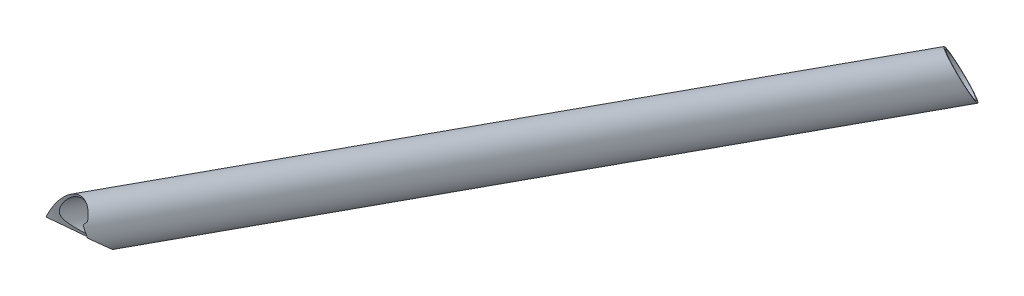
ISO-10303-21;
HEADER;
FILE_DESCRIPTION(('STEP AP214'),'2;1');
FILE_NAME('part.step','',(''),(''),'','','');
FILE_SCHEMA(('AUTOMOTIVE_DESIGN { 1 0 10303 214 1 1 1 1 }'));
ENDSEC;
DATA;
#1=APPLICATION_CONTEXT('core data for automotive mechanical design processes');
#2=APPLICATION_PROTOCOL_DEFINITION('international standard','automotive_design',2000,#1);
#3=PRODUCT_CONTEXT('',#1,'mechanical');
#4=PRODUCT('Part','Part','',(#3));
#5=PRODUCT_RELATED_PRODUCT_CATEGORY('part','',(#4));
#6=PRODUCT_DEFINITION_FORMATION('','',#4);
#7=PRODUCT_DEFINITION_CONTEXT('part definition',#1,'design');
#8=PRODUCT_DEFINITION('design','',#6,#7);
#9=PRODUCT_DEFINITION_SHAPE('','',#8);
#10=(LENGTH_UNIT() NAMED_UNIT(*) SI_UNIT(.MILLI.,.METRE.));
#11=(NAMED_UNIT(*) PLANE_ANGLE_UNIT() SI_UNIT($,.RADIAN.));
#12=(NAMED_UNIT(*) SI_UNIT($,.STERADIAN.) SOLID_ANGLE_UNIT());
#13=UNCERTAINTY_MEASURE_WITH_UNIT(LENGTH_MEASURE(1.E-05),#10,'distance_accuracy_value','');
#14=(GEOMETRIC_REPRESENTATION_CONTEXT(3) GLOBAL_UNCERTAINTY_ASSIGNED_CONTEXT((#13)) GLOBAL_UNIT_ASSIGNED_CONTEXT((#10,
#11,#12)) REPRESENTATION_CONTEXT('',''));
#15=CARTESIAN_POINT('',(0.,0.,0.));
#16=DIRECTION('',(0.,0.,1.));
#17=DIRECTION('',(1.,0.,0.));
#18=AXIS2_PLACEMENT_3D('',#15,#16,#17);
#19=CARTESIAN_POINT('',(-325.,320.000000000001,-1580.));
#20=DIRECTION('',(0.171152156864514,-0.228202875819352,-0.958452078441276));
#21=DIRECTION('',(0.,0.972806214685367,-0.23162052730604));
#22=AXIS2_PLACEMENT_3D('',#19,#20,#21);
#23=CYLINDRICAL_SURFACE('',#22,11.3);
#24=CARTESIAN_POINT('',(-247.021624977949,216.028833303932,-2016.67890012349));
#25=DIRECTION('',(0.452196947301957,0.442935804004753,-0.774161349061973));
#26=DIRECTION('',(-0.2208732865147,-0.785327240941154,-0.578339101168122));
#27=AXIS2_PLACEMENT_3D('',#24,#25,#26);
#28=ELLIPSE('',#27,15.7313297667967,11.3);
#29=CARTESIAN_POINT('',(-250.496255484788,203.674591501838,-2025.77694324099));
#30=VERTEX_POINT('',#29);
#31=EDGE_CURVE('E92',#30,#30,#28,.T.);
#32=ORIENTED_EDGE('',*,*,#31,.T.);
#33=EDGE_LOOP('',(#32));
#34=FACE_BOUND('',#33,.T.);
#35=CARTESIAN_POINT('',(-323.751258230113,329.327721199429,-1589.61026586993));
#36=CARTESIAN_POINT('',(-324.041741552459,329.311996243925,-1589.67631641611));
#37=CARTESIAN_POINT('',(-324.333259405906,329.285849810839,-1589.73525665512));
#38=CARTESIAN_POINT('',(-324.916306957658,329.212853012217,-1589.83832996622));
#39=CARTESIAN_POINT('',(-325.207836652548,329.166004506466,-1589.88246436776));
#40=CARTESIAN_POINT('',(-325.788722927312,329.051946080014,-1589.95555465044));
#41=CARTESIAN_POINT('',(-326.078080063961,328.984741572227,-1589.98451456108));
#42=CARTESIAN_POINT('',(-326.652602594052,328.830481437029,-1590.02715435897));
#43=CARTESIAN_POINT('',(-326.937767889434,328.743425346011,-1590.04083388931));
#44=CARTESIAN_POINT('',(-327.501609247605,328.550233276816,-1590.05303025706));
#45=CARTESIAN_POINT('',(-327.78029070413,328.444113848369,-1590.05156018461));
#46=CARTESIAN_POINT('',(-328.329481908372,328.213570460657,-1590.03385215686));
#47=CARTESIAN_POINT('',(-328.599991704135,328.089146609036,-1590.01761428841));
#48=CARTESIAN_POINT('',(-329.131022234793,327.822930037697,-1589.97096483869));
#49=CARTESIAN_POINT('',(-329.391543716696,327.68113862021,-1589.94055431961));
#50=CARTESIAN_POINT('',(-329.900977922361,327.381161531198,-1589.86637028519));
#51=CARTESIAN_POINT('',(-330.149890435476,327.222975562357,-1589.82259652749));
#52=CARTESIAN_POINT('',(-330.640221357807,326.887368497511,-1589.72155088308));
#53=CARTESIAN_POINT('',(-330.881333786556,326.709587451766,-1589.66399052086));
#54=CARTESIAN_POINT('',(-331.348421578,326.338926653219,-1589.53726973269));
#55=CARTESIAN_POINT('',(-331.574396542985,326.146046504002,-1589.46810900213));
#56=CARTESIAN_POINT('',(-332.010208439658,325.745845430282,-1589.31965798748));
#57=CARTESIAN_POINT('',(-332.220022856131,325.538505098897,-1589.24035396639));
#58=CARTESIAN_POINT('',(-332.621953313275,325.110412633486,-1589.07357261488));
#59=CARTESIAN_POINT('',(-332.814069569966,324.889660663215,-1588.98609538425));
#60=CARTESIAN_POINT('',(-333.192961540393,324.418499110931,-1588.79852894446));
#61=CARTESIAN_POINT('',(-333.378289135681,324.167103782964,-1588.69798548307));
#62=CARTESIAN_POINT('',(-333.725688145917,323.649834040866,-1588.49355639102));
#63=CARTESIAN_POINT('',(-333.887751009736,323.383954352178,-1588.38966954856));
#64=CARTESIAN_POINT('',(-334.186487478159,322.838349137935,-1588.1834118901));
#65=CARTESIAN_POINT('',(-334.323203726046,322.558647888946,-1588.08103879944));
#66=CARTESIAN_POINT('',(-334.569252622558,321.984940422908,-1587.88397965418));
#67=CARTESIAN_POINT('',(-334.678610082431,321.690947457941,-1587.78928668767));
#68=CARTESIAN_POINT('',(-334.823223665689,321.228972716068,-1587.65666150823));
#69=CARTESIAN_POINT('',(-334.86927957078,321.066025853175,-1587.61282359525));
#70=CARTESIAN_POINT('',(-334.952242868899,320.736266226439,-1587.53159362452));
#71=CARTESIAN_POINT('',(-334.98915368697,320.569454935584,-1587.49419915515));
#72=CARTESIAN_POINT('',(-335.053246354102,320.232726954294,-1587.42781260805));
#73=CARTESIAN_POINT('',(-335.080451451025,320.062818723045,-1587.39880048446));
#74=CARTESIAN_POINT('',(-335.124810645557,319.720229887382,-1587.35104172031));
#75=CARTESIAN_POINT('',(-335.141964853109,319.547549313315,-1587.33229496746));
#76=CARTESIAN_POINT('',(-335.166117345776,319.198311077857,-1587.30674813398));
#77=CARTESIAN_POINT('',(-335.172981761045,319.021732138022,-1587.30010528955));
#78=CARTESIAN_POINT('',(-335.176203162723,318.668500850097,-1587.30066893354));
#79=CARTESIAN_POINT('',(-335.17256139634,318.49184851321,-1587.30787377805));
#80=CARTESIAN_POINT('',(-335.155282731625,318.140247396349,-1587.33671800154));
#81=CARTESIAN_POINT('',(-335.141647216914,317.96529838395,-1587.35835538234));
#82=CARTESIAN_POINT('',(-335.105291773105,317.618684906002,-1587.41568629307));
#83=CARTESIAN_POINT('',(-335.082570263493,317.447021017348,-1587.45138226849));
#84=CARTESIAN_POINT('',(-335.024778247906,317.080180733582,-1587.54262674341));
#85=CARTESIAN_POINT('',(-334.988287676058,316.885805680774,-1587.60048087486));
#86=CARTESIAN_POINT('',(-334.906397515816,316.504096956015,-1587.73106977175));
#87=CARTESIAN_POINT('',(-334.860995054156,316.316765578274,-1587.80380933671));
#88=CARTESIAN_POINT('',(-334.762729262056,315.948552686318,-1587.96169275098));
#89=CARTESIAN_POINT('',(-334.709836441974,315.76770038679,-1588.04688567425));
#90=CARTESIAN_POINT('',(-334.598037480197,315.412878340422,-1588.22691945225));
#91=CARTESIAN_POINT('',(-334.539131935136,315.238907913075,-1588.32175934971));
#92=CARTESIAN_POINT('',(-334.391852680283,314.829269447575,-1588.5581881768));
#93=CARTESIAN_POINT('',(-334.30107083218,314.596556254696,-1588.70337782912));
#94=CARTESIAN_POINT('',(-334.111370431192,314.141350537203,-1589.00419779822));
#95=CARTESIAN_POINT('',(-334.012447434317,313.918863699481,-1589.15983380866));
#96=CARTESIAN_POINT('',(-333.80734052403,313.482178910973,-1589.47873219965));
#97=CARTESIAN_POINT('',(-333.701142983559,313.267997762504,-1589.64200870096));
#98=CARTESIAN_POINT('',(-333.482295353644,312.847123360164,-1589.97366114461));
#99=CARTESIAN_POINT('',(-333.369646536747,312.640428642599,-1590.1420360782));
#100=CARTESIAN_POINT('',(-333.137591221974,312.232394799222,-1590.48321610394));
#101=CARTESIAN_POINT('',(-333.018151681567,312.031090396413,-1590.65604013168));
#102=CARTESIAN_POINT('',(-332.773225529482,311.634245309623,-1591.0040105314));
#103=CARTESIAN_POINT('',(-332.647738685614,311.438704847416,-1591.17915699236));
#104=CARTESIAN_POINT('',(-332.390900855709,311.053076069143,-1591.53060112541));
#105=CARTESIAN_POINT('',(-332.259556601272,310.862981886779,-1591.70689728684));
#106=CARTESIAN_POINT('',(-331.990816595712,310.487651525924,-1592.06005082119));
#107=CARTESIAN_POINT('',(-331.853420758798,310.302415416365,-1592.23690820202));
#108=CARTESIAN_POINT('',(-331.559421515836,309.919607473818,-1592.60691312888));
#109=CARTESIAN_POINT('',(-331.402218628345,309.722485233273,-1592.80004999189));
#110=CARTESIAN_POINT('',(-331.080193526084,309.333636840674,-1593.18541282211));
#111=CARTESIAN_POINT('',(-330.915371190314,309.141910774391,-1593.3776387748));
#112=CARTESIAN_POINT('',(-330.577678858847,308.763751202199,-1593.76057037541));
#113=CARTESIAN_POINT('',(-330.404803712267,308.577321210059,-1593.95127495628));
#114=CARTESIAN_POINT('',(-330.050715383068,308.210047054585,-1594.33030275246));
#115=CARTESIAN_POINT('',(-329.869502457027,308.029202719648,-1594.51862604083));
#116=CARTESIAN_POINT('',(-329.499396621347,307.674483025716,-1594.89099215815));
#117=CARTESIAN_POINT('',(-329.310557355195,307.50057185984,-1595.07505410094));
#118=CARTESIAN_POINT('',(-328.923620580929,307.159000638051,-1595.43926270048));
#119=CARTESIAN_POINT('',(-328.725522488508,306.991340977863,-1595.61940910907));
#120=CARTESIAN_POINT('',(-328.319639643565,306.66305990845,-1595.97467124303));
#121=CARTESIAN_POINT('',(-328.111863566001,306.502432437221,-1596.14979125463));
#122=CARTESIAN_POINT('',(-327.685801598423,306.188928236851,-1596.49401999933));
#123=CARTESIAN_POINT('',(-327.46751793965,306.036049876251,-1596.66312999549));
#124=CARTESIAN_POINT('',(-327.071435094099,305.773472091093,-1596.95573746248));
#125=CARTESIAN_POINT('',(-326.895946880236,305.66196292281,-1597.08073943691));
#126=CARTESIAN_POINT('',(-326.537914038257,305.444816706861,-1597.325645961));
#127=CARTESIAN_POINT('',(-326.355369751816,305.339179375467,-1597.4455507569));
#128=CARTESIAN_POINT('',(-325.982560871548,305.134407501147,-1597.67954598272));
#129=CARTESIAN_POINT('',(-325.792285166204,305.03528289475,-1597.79362747141));
#130=CARTESIAN_POINT('',(-325.40391561831,304.844683407837,-1598.01469369533));
#131=CARTESIAN_POINT('',(-325.205821727573,304.753208574478,-1598.12167838681));
#132=CARTESIAN_POINT('',(-324.79964066816,304.578296811185,-1598.32818096932));
#133=CARTESIAN_POINT('',(-324.591479025948,304.494940508375,-1598.42762214312));
#134=CARTESIAN_POINT('',(-324.166793398036,304.338734617483,-1598.61627288983));
#135=CARTESIAN_POINT('',(-323.950268357329,304.265886360469,-1598.70548116625));
#136=CARTESIAN_POINT('',(-323.28885089704,304.065976796177,-1598.95456487398));
#137=CARTESIAN_POINT('',(-322.830897702026,303.957005253197,-1599.09654148468));
#138=CARTESIAN_POINT('',(-322.03459456998,303.828924705383,-1599.27902110132));
#139=CARTESIAN_POINT('',(-321.703234443465,303.792422694356,-1599.33734165765));
#140=CARTESIAN_POINT('',(-321.201466758177,303.76572843781,-1599.39550932695));
#141=CARTESIAN_POINT('',(-321.033425707579,303.761506653433,-1599.41001302498));
#142=CARTESIAN_POINT('',(-320.696838928207,303.762978109627,-1599.42857233779));
#143=CARTESIAN_POINT('',(-320.528293434349,303.768667289592,-1599.4326322298));
#144=CARTESIAN_POINT('',(-320.190745840791,303.790440442642,-1599.42977884228));
#145=CARTESIAN_POINT('',(-320.021749088605,303.806598425372,-1599.42278692086));
#146=CARTESIAN_POINT('',(-319.685961874365,303.849523849109,-1599.39743450421));
#147=CARTESIAN_POINT('',(-319.519171394974,303.876291206704,-1599.37907409836));
#148=CARTESIAN_POINT('',(-319.189251749861,303.940280479325,-1599.33105928373));
#149=CARTESIAN_POINT('',(-319.026122849384,303.977503149117,-1599.30140405952));
#150=CARTESIAN_POINT('',(-318.70488585166,304.061947784595,-1599.23120470535));
#151=CARTESIAN_POINT('',(-318.546777645438,304.109169533079,-1599.19066081191));
#152=CARTESIAN_POINT('',(-318.249811101207,304.208524745365,-1599.10323025427));
#153=CARTESIAN_POINT('',(-318.110455274599,304.259905660957,-1599.05716938872));
#154=CARTESIAN_POINT('',(-317.837483776558,304.369811655641,-1598.95716003113));
#155=CARTESIAN_POINT('',(-317.703869955359,304.428339014524,-1598.90320902095));
#156=CARTESIAN_POINT('',(-317.312395459032,304.613552590078,-1598.73064943269));
#157=CARTESIAN_POINT('',(-317.063780055144,304.749911913345,-1598.60129749982));
#158=CARTESIAN_POINT('',(-316.458767467789,305.125852587942,-1598.24019155288));
#159=CARTESIAN_POINT('',(-316.121340576415,305.380076868908,-1597.99200036161));
#160=CARTESIAN_POINT('',(-315.659882857279,305.784867507471,-1597.59314794569));
#161=CARTESIAN_POINT('',(-315.513295196593,305.923968864014,-1597.45550724403));
#162=CARTESIAN_POINT('',(-315.233905080624,306.208570705367,-1597.17301459981));
#163=CARTESIAN_POINT('',(-315.101100092467,306.354070007389,-1597.0281639895));
#164=CARTESIAN_POINT('',(-314.756090991496,306.758051159086,-1596.62513654624));
#165=CARTESIAN_POINT('',(-314.556516290181,307.021630828621,-1596.36126736557));
#166=CARTESIAN_POINT('',(-314.19004879743,307.559551219769,-1595.8219693053));
#167=CARTESIAN_POINT('',(-314.023181894077,307.833900260814,-1595.54653147685));
#168=CARTESIAN_POINT('',(-313.717393274215,308.391147794215,-1594.98719051994));
#169=CARTESIAN_POINT('',(-313.578554008258,308.674068774187,-1594.70326515707));
#170=CARTESIAN_POINT('',(-313.325847951824,309.245750611836,-1594.13052342057));
#171=CARTESIAN_POINT('',(-313.211974240051,309.534509826649,-1593.84170842648));
#172=CARTESIAN_POINT('',(-313.010072262168,310.106039816569,-1593.27187686241));
#173=CARTESIAN_POINT('',(-312.921243924989,310.388637132615,-1592.99096689131));
#174=CARTESIAN_POINT('',(-312.761969477822,310.95774478062,-1592.4278332185));
#175=CARTESIAN_POINT('',(-312.691526786737,311.244255829948,-1592.14560928237));
#176=CARTESIAN_POINT('',(-312.567347042405,311.82124380025,-1591.58085564856));
#177=CARTESIAN_POINT('',(-312.513630283743,312.11172509611,-1591.29832599361));
#178=CARTESIAN_POINT('',(-312.421748521439,312.696342870381,-1590.73458614264));
#179=CARTESIAN_POINT('',(-312.383582300795,312.9904790609,-1590.45337584505));
#180=CARTESIAN_POINT('',(-312.321869475436,313.582443841861,-1589.89392426306));
#181=CARTESIAN_POINT('',(-312.298306582916,313.880267939311,-1589.61568001227));
#182=CARTESIAN_POINT('',(-312.265068492927,314.480643205733,-1589.0634171704));
#183=CARTESIAN_POINT('',(-312.255394886551,314.783194912265,-1588.78939906701));
#184=CARTESIAN_POINT('',(-312.249595606928,315.393685533546,-1588.24807563441));
#185=CARTESIAN_POINT('',(-312.253452391568,315.701616958192,-1587.98076206559));
#186=CARTESIAN_POINT('',(-312.274697426952,316.324805445706,-1587.4554511517));
#187=CARTESIAN_POINT('',(-312.292081836171,316.64006040421,-1587.19745118355));
#188=CARTESIAN_POINT('',(-312.332422205134,317.168576710109,-1586.78284880886));
#189=CARTESIAN_POINT('',(-312.351316462699,317.379036841275,-1586.62228238584));
#190=CARTESIAN_POINT('',(-312.395425253175,317.804986776936,-1586.30875554599));
#191=CARTESIAN_POINT('',(-312.420640584158,318.020477213418,-1586.15579609251));
#192=CARTESIAN_POINT('',(-312.477877073031,318.457167895363,-1585.86013445846));
#193=CARTESIAN_POINT('',(-312.509889939476,318.678360898782,-1585.7174200625));
#194=CARTESIAN_POINT('',(-312.581513554416,319.127706418448,-1585.44544739057));
#195=CARTESIAN_POINT('',(-312.621121629955,319.355856462644,-1585.31618440529));
#196=CARTESIAN_POINT('',(-312.695271388087,319.747267068021,-1585.11337658427));
#197=CARTESIAN_POINT('',(-312.727517235509,319.908481457238,-1585.03505733349));
#198=CARTESIAN_POINT('',(-312.796555298248,320.234599277384,-1584.88884276633));
#199=CARTESIAN_POINT('',(-312.833345824363,320.399501319105,-1584.82094359785));
#200=CARTESIAN_POINT('',(-312.911886211096,320.73241851698,-1584.69776928909));
#201=CARTESIAN_POINT('',(-312.953624948781,320.900426000418,-1584.64246662197));
#202=CARTESIAN_POINT('',(-313.042611728338,321.239147575826,-1584.54643760767));
#203=CARTESIAN_POINT('',(-313.089858407117,321.409860989141,-1584.50570766418));
#204=CARTESIAN_POINT('',(-313.183018414107,321.727922856161,-1584.44531065863));
#205=CARTESIAN_POINT('',(-313.22813949774,321.875086397599,-1584.42345167615));
#206=CARTESIAN_POINT('',(-313.322880329165,322.169300769648,-1584.39239486906));
#207=CARTESIAN_POINT('',(-313.372499549853,322.316351611433,-1584.38319556299));
#208=CARTESIAN_POINT('',(-313.476308768981,322.609086401076,-1584.37757146445));
#209=CARTESIAN_POINT('',(-313.530499038896,322.754770267179,-1584.38114743123));
#210=CARTESIAN_POINT('',(-313.643427092114,323.043545283466,-1584.40056614603));
#211=CARTESIAN_POINT('',(-313.702165789413,323.186635905379,-1584.41641136532));
#212=CARTESIAN_POINT('',(-313.837981747323,323.501323108378,-1584.46425064427));
#213=CARTESIAN_POINT('',(-313.916190775192,323.671998257823,-1584.49909864775));
#214=CARTESIAN_POINT('',(-314.079129255056,324.006513298645,-1584.58325884162));
#215=CARTESIAN_POINT('',(-314.163860634862,324.170351146885,-1584.63257532066));
#216=CARTESIAN_POINT('',(-314.339912075743,324.490938102564,-1584.74313248361));
#217=CARTESIAN_POINT('',(-314.431251423731,324.647664092348,-1584.80440903862));
#218=CARTESIAN_POINT('',(-314.620166851179,324.953262829518,-1584.93627546229));
#219=CARTESIAN_POINT('',(-314.717745119427,325.102132786981,-1585.00686860883));
#220=CARTESIAN_POINT('',(-314.972883247554,325.469525237977,-1585.19480951489));
#221=CARTESIAN_POINT('',(-315.134607568915,325.68270889904,-1585.3169678333));
#222=CARTESIAN_POINT('',(-315.472246261984,326.09091773746,-1585.5716255199));
#223=CARTESIAN_POINT('',(-315.648167718776,326.285933742348,-1585.70413005028));
#224=CARTESIAN_POINT('',(-316.013970392474,326.658269235374,-1585.97479169515));
#225=CARTESIAN_POINT('',(-316.203856537836,326.835582423232,-1586.11295079755));
#226=CARTESIAN_POINT('',(-316.597170527829,327.172654401223,-1586.39124995041));
#227=CARTESIAN_POINT('',(-316.800596254432,327.332415926687,-1586.53138968833));
#228=CARTESIAN_POINT('',(-317.228901804239,327.640427344532,-1586.81636522295));
#229=CARTESIAN_POINT('',(-317.45431210564,327.787971296256,-1586.96116734168));
#230=CARTESIAN_POINT('',(-317.918678394088,328.063951108611,-1587.24724310637));
#231=CARTESIAN_POINT('',(-318.157634867199,328.192386282981,-1587.38851662544));
#232=CARTESIAN_POINT('',(-318.6482020094,328.429747204232,-1587.66527872673));
#233=CARTESIAN_POINT('',(-318.899810526864,328.538676254079,-1587.80076828538));
#234=CARTESIAN_POINT('',(-319.414649975499,328.736565568647,-1588.06402853228));
#235=CARTESIAN_POINT('',(-319.677880793885,328.825526027095,-1588.19179929542));
#236=CARTESIAN_POINT('',(-320.243882049828,328.991512793551,-1588.45125845014));
#237=CARTESIAN_POINT('',(-320.547841985481,329.066193908489,-1588.58186541237));
#238=CARTESIAN_POINT('',(-321.166465586699,329.189688814995,-1588.82935158777));
#239=CARTESIAN_POINT('',(-321.481130291899,329.238500086438,-1588.94622946266));
#240=CARTESIAN_POINT('',(-322.118688356076,329.309676368437,-1589.16438670105));
#241=CARTESIAN_POINT('',(-322.441579903981,329.332047149139,-1589.26566946369));
#242=CARTESIAN_POINT('',(-323.092956344179,329.349994836862,-1589.45111061813));
#243=CARTESIAN_POINT('',(-323.421440450781,329.345575477128,-1589.5352713942));
#244=CARTESIAN_POINT('',(-323.751258230113,329.327721199429,-1589.61026586993));
#245=B_SPLINE_CURVE_WITH_KNOTS('',3,(#35,#36,#37,#38,#39,#40,#41,#42,#43,#44,#45,#46,#47,#48,
#49,#50,#51,#52,#53,#54,#55,#56,#57,#58,#59,#60,#61,#62,#63,#64,#65,#66,#67,#68,#69,#70,#71,#72,
#73,#74,#75,#76,#77,#78,#79,#80,#81,#82,#83,#84,#85,#86,#87,#88,#89,#90,#91,#92,#93,#94,#95,#96,
#97,#98,#99,#100,#101,#102,#103,#104,#105,#106,#107,#108,#109,#110,#111,#112,#113,#114,#115,
#116,#117,#118,#119,#120,#121,#122,#123,#124,#125,#126,#127,#128,#129,#130,#131,#132,#133,#134,
#135,#136,#137,#138,#139,#140,#141,#142,#143,#144,#145,#146,#147,#148,#149,#150,#151,#152,#153,
#154,#155,#156,#157,#158,#159,#160,#161,#162,#163,#164,#165,#166,#167,#168,#169,#170,#171,#172,
#173,#174,#175,#176,#177,#178,#179,#180,#181,#182,#183,#184,#185,#186,#187,#188,#189,#190,#191,
#192,#193,#194,#195,#196,#197,#198,#199,#200,#201,#202,#203,#204,#205,#206,#207,#208,#209,#210,
#211,#212,#213,#214,#215,#216,#217,#218,#219,#220,#221,#222,#223,#224,#225,#226,#227,#228,#229,
#230,#231,#232,#233,#234,#235,#236,#237,#238,#239,#240,#241,#242,#243,#244),.UNSPECIFIED.,.T.,
.F.,(4,2,2,2,2,2,2,2,2,2,2,2,2,2,2,2,2,2,2,2,2,2,2,2,2,2,2,2,2,2,2,2,2,2,2,2,2,2,2,2,2,2,2,2,2,
2,2,2,2,2,2,2,2,2,2,2,2,2,2,2,2,2,2,2,2,2,2,2,2,2,2,2,2,2,2,2,2,2,2,2,2,2,2,2,2,2,2,2,2,2,2,2,2,
2,2,2,2,2,2,2,2,2,2,2,4),(0.,0.894635987307796,1.7891916206759,2.68350958908827,
3.57784844528136,4.47141460566159,5.36497551132171,6.25846945823211,7.15197961149649,
8.06613194079012,8.98030827847004,9.89573605451549,10.8111526555351,11.7943341947349,
12.7778761895432,13.7597481466324,14.7407264052951,15.2651409067668,15.789358705291,
16.312312292101,16.8352601583771,17.3649542403729,17.8945854439589,18.424143334684,
18.9537933823641,19.5709531382046,20.188312199254,20.8081731169598,21.4279725863002,
22.2940713790285,23.1606461233791,24.028891085607,24.8969653681981,25.7697015581614,
26.6424712839646,27.5142626058403,28.3860662908151,29.3387386955875,30.2914262342374,
31.2447317476274,32.1980079444458,33.1454640820916,34.0929800927902,35.0396625452415,
35.9861448527654,36.7137539508475,37.4413278601697,38.1699872258727,38.8986510832162,
39.6339388097326,40.3693195943521,41.8356756620686,42.8469485904245,43.352568673602,
43.8579816486753,44.3670072347013,44.8760288188045,45.3850871583832,45.8941344412581,
46.3601540745495,46.8263227633477,47.758263052109,49.2194442715568,49.952586041692,
50.6855928411364,51.9525336692479,53.2204732619304,54.492090149541,55.7633540549089,
56.9876043509358,58.2120821404787,59.438039924945,60.6639017462225,61.8883938316542,
63.1130261780651,64.3360713792703,65.5587693913371,66.3547601183146,67.1508513943045,
67.9459771418271,68.7408235754736,69.2868326144986,69.832639315866,70.3772415839034,
70.9217093601147,71.3875726688217,71.8533814567828,72.3192179286758,72.7851482534439,
73.3570866802912,73.929194808789,74.5030459495803,75.077099530058,75.9582246078316,
76.8397921632066,77.7216723508424,78.6034149067148,79.5200579857263,80.4367339766126,
81.3532545999939,82.2697663313093,83.2858097190361,84.3019520670072,85.3178726198013,
86.3336516058735),.UNSPECIFIED.);
#246=CARTESIAN_POINT('',(-323.751258230113,329.327721199429,-1589.61026586993));
#247=VERTEX_POINT('',#246);
#248=EDGE_CURVE('E87',#247,#247,#245,.T.);
#249=ORIENTED_EDGE('',*,*,#248,.T.);
#250=EDGE_LOOP('',(#249));
#251=FACE_BOUND('',#250,.T.);
#252=ADVANCED_FACE('F41',(#34,#251),#23,.F.);
#253=CARTESIAN_POINT('',(-325.,320.000000000001,-1580.));
#254=DIRECTION('',(0.171152156864514,-0.228202875819352,-0.958452078441276));
#255=DIRECTION('',(0.,0.972806214685367,-0.23162052730604));
#256=AXIS2_PLACEMENT_3D('',#253,#254,#255);
#257=CYLINDRICAL_SURFACE('',#256,12.5);
#258=CARTESIAN_POINT('',(-247.021624977949,216.028833303932,-2016.67890012349));
#259=DIRECTION('',(0.452196947301957,0.442935804004753,-0.774161349061973));
#260=DIRECTION('',(-0.2208732865147,-0.785327240941154,-0.578339101168122));
#261=AXIS2_PLACEMENT_3D('',#258,#259,#260);
#262=ELLIPSE('',#261,17.401913458846,12.5);
#263=CARTESIAN_POINT('',(-250.865242795249,202.3626366202,-2026.74310711188));
#264=VERTEX_POINT('',#263);
#265=EDGE_CURVE('E85',#264,#264,#262,.T.);
#266=ORIENTED_EDGE('',*,*,#265,.F.);
#267=EDGE_LOOP('',(#266));
#268=FACE_BOUND('',#267,.T.);
#269=CARTESIAN_POINT('',(-325.,320.,-1580.));
#270=DIRECTION('',(0.492848464858469,-0.860535216309269,-0.128761532214443));
#271=DIRECTION('',(-0.0306416701609081,0.130725495483689,-0.990944969652853));
#272=AXIS2_PLACEMENT_3D('',#269,#270,#271);
#273=ELLIPSE('',#272,30.9298415719433,12.5);
#274=CARTESIAN_POINT('',(-314.143685620971,326.206690752004,-1579.92667136909));
#275=VERTEX_POINT('',#274);
#276=CARTESIAN_POINT('',(-314.27691466749,326.523151813059,-1582.55158280695));
#277=VERTEX_POINT('',#276);
#278=EDGE_CURVE('E70',#275,#277,#273,.F.);
#279=ORIENTED_EDGE('',*,*,#278,.F.);
#280=CARTESIAN_POINT('',(-325.,320.000000000001,-1580.));
#281=DIRECTION('',(-0.0427126536783039,0.0629297921225688,0.997103540500769));
#282=DIRECTION('',(0.611440895819701,-0.787641342485716,0.0759022168747456));
#283=AXIS2_PLACEMENT_3D('',#280,#281,#282);
#284=ELLIPSE('',#283,12.7897245671064,12.5);
#285=CARTESIAN_POINT('',(-313.287224923607,324.429594636004,-1579.7778262469));
#286=VERTEX_POINT('',#285);
#287=EDGE_CURVE('E46',#286,#275,#284,.T.);
#288=ORIENTED_EDGE('',*,*,#287,.F.);
#289=CARTESIAN_POINT('',(-325.,320.,-1580.));
#290=DIRECTION('',(-0.0306416701609081,0.130725495483689,-0.990944969652853));
#291=DIRECTION('',(0.492848464858469,-0.860535216309269,-0.128761532214443));
#292=AXIS2_PLACEMENT_3D('',#289,#290,#291);
#293=ELLIPSE('',#292,13.6657283969918,12.5);
#294=CARTESIAN_POINT('',(-312.291282792699,320.507519485611,-1580.32602273033));
#295=VERTEX_POINT('',#294);
#296=EDGE_CURVE('E73',#295,#286,#293,.F.);
#297=ORIENTED_EDGE('',*,*,#296,.F.);
#298=CARTESIAN_POINT('',(-325.,320.000000000001,-1580.));
#299=DIRECTION('',(-0.046806891515563,0.743683273485426,-0.666891523146495));
#300=DIRECTION('',(0.217268286027578,-0.644059979147453,-0.733472041148959));
#301=AXIS2_PLACEMENT_3D('',#298,#299,#300);
#302=ELLIPSE('',#301,27.087832369482,12.5);
#303=CARTESIAN_POINT('',(-337.187362863288,317.759675944249,-1581.64290430755));
#304=VERTEX_POINT('',#303);
#305=EDGE_CURVE('E51',#304,#295,#302,.F.);
#306=ORIENTED_EDGE('',*,*,#305,.F.);
#307=CARTESIAN_POINT('',(-325.,320.000000000001,-1580.));
#308=DIRECTION('',(0.217268286027578,-0.644059979147453,-0.733472041148959));
#309=DIRECTION('',(-0.046806891515563,0.743683273485426,-0.666891523146495));
#310=AXIS2_PLACEMENT_3D('',#307,#308,#309);
#311=ELLIPSE('',#310,14.0899036336084,12.5);
#312=EDGE_CURVE('E61',#277,#304,#311,.F.);
#313=ORIENTED_EDGE('',*,*,#312,.F.);
#314=EDGE_LOOP('',(#279,#288,#297,#306,#313));
#315=FACE_BOUND('',#314,.T.);
#316=ADVANCED_FACE('F84',(#268,#315),#257,.T.);
#317=CARTESIAN_POINT('',(-233.545824520408,220.13026333114,-2006.46089318526));
#318=DIRECTION('',(0.452196947301957,0.442935804004753,-0.774161349061973));
#319=DIRECTION('',(-0.863486111934493,0.,-0.504372614736617));
#320=AXIS2_PLACEMENT_3D('',#317,#318,#319);
#321=PLANE('',#320);
#322=ORIENTED_EDGE('',*,*,#31,.F.);
#323=EDGE_LOOP('',(#322));
#324=FACE_BOUND('',#323,.T.);
#325=ORIENTED_EDGE('',*,*,#265,.T.);
#326=EDGE_LOOP('',(#325));
#327=FACE_BOUND('',#326,.T.);
#328=ADVANCED_FACE('F106',(#324,#327),#321,.T.);
#329=CARTESIAN_POINT('',(-325.,320.,-1580.));
#330=DIRECTION('',(-0.0427126536783039,0.0629297921225688,0.997103540500769));
#331=DIRECTION('',(0.,-0.998014330188054,0.0629872744234135));
#332=AXIS2_PLACEMENT_3D('',#329,#330,#331);
#333=PLANE('',#332);
#334=ORIENTED_EDGE('',*,*,#287,.T.);
#335=CARTESIAN_POINT('',(-324.999999999999,320.,-1580.));
#336=DIRECTION('',(-0.0427126536783039,0.0629297921225688,0.997103540500769));
#337=DIRECTION('',(0.449608041943724,-0.890035166065743,0.0754321667848474));
#338=AXIS2_PLACEMENT_3D('',#335,#336,#337);
#339=ELLIPSE('',#338,15.3791838355893,12.5);
#340=EDGE_CURVE('E76',#275,#286,#339,.F.);
#341=ORIENTED_EDGE('',*,*,#340,.T.);
#342=EDGE_LOOP('',(#334,#341));
#343=FACE_BOUND('',#342,.T.);
#344=ADVANCED_FACE('F82',(#343),#333,.T.);
#345=CARTESIAN_POINT('',(-325.,320.000000000001,-1580.));
#346=DIRECTION('',(0.227207840964845,-0.4673512982197,0.85437659205789));
#347=DIRECTION('',(0.,-0.877321812102288,-0.479902529696977));
#348=AXIS2_PLACEMENT_3D('',#345,#346,#347);
#349=CYLINDRICAL_SURFACE('',#348,12.5);
#350=ORIENTED_EDGE('',*,*,#278,.T.);
#351=CARTESIAN_POINT('',(-325.,320.,-1580.));
#352=DIRECTION('',(0.0100583123703578,0.349879267870479,0.936740801004567));
#353=DIRECTION('',(-0.287052887423582,0.898369431045867,-0.332465043552115));
#354=AXIS2_PLACEMENT_3D('',#351,#352,#353);
#355=ELLIPSE('',#354,19.5588092612866,12.5);
#356=EDGE_CURVE('E11',#295,#277,#355,.T.);
#357=ORIENTED_EDGE('',*,*,#356,.F.);
#358=ORIENTED_EDGE('',*,*,#296,.T.);
#359=ORIENTED_EDGE('',*,*,#340,.F.);
#360=EDGE_LOOP('',(#350,#357,#358,#359));
#361=FACE_BOUND('',#360,.T.);
#362=ADVANCED_FACE('F75',(#361),#349,.F.);
#363=CARTESIAN_POINT('',(-250.,0.,-1700.));
#364=DIRECTION('',(-0.214351342090107,0.914565726251124,0.342962147344171));
#365=DIRECTION('',(0.,-0.351123441588391,0.936329177569045));
#366=AXIS2_PLACEMENT_3D('',#363,#364,#365);
#367=CYLINDRICAL_SURFACE('',#366,12.5);
#368=ORIENTED_EDGE('',*,*,#248,.F.);
#369=EDGE_LOOP('',(#368));
#370=FACE_BOUND('',#369,.T.);
#371=ORIENTED_EDGE('',*,*,#312,.T.);
#372=ORIENTED_EDGE('',*,*,#305,.T.);
#373=ORIENTED_EDGE('',*,*,#356,.T.);
#374=EDGE_LOOP('',(#371,#372,#373));
#375=FACE_BOUND('',#374,.T.);
#376=ADVANCED_FACE('F43',(#370,#375),#367,.F.);
#377=CLOSED_SHELL('',(#252,#316,#328,#344,#362,#376));
#378=MANIFOLD_SOLID_BREP('B2',#377);
#379=ADVANCED_BREP_SHAPE_REPRESENTATION('',(#18,#378),#14);
#380=SHAPE_DEFINITION_REPRESENTATION(#9,#379);
ENDSEC;
END-ISO-10303-21;
